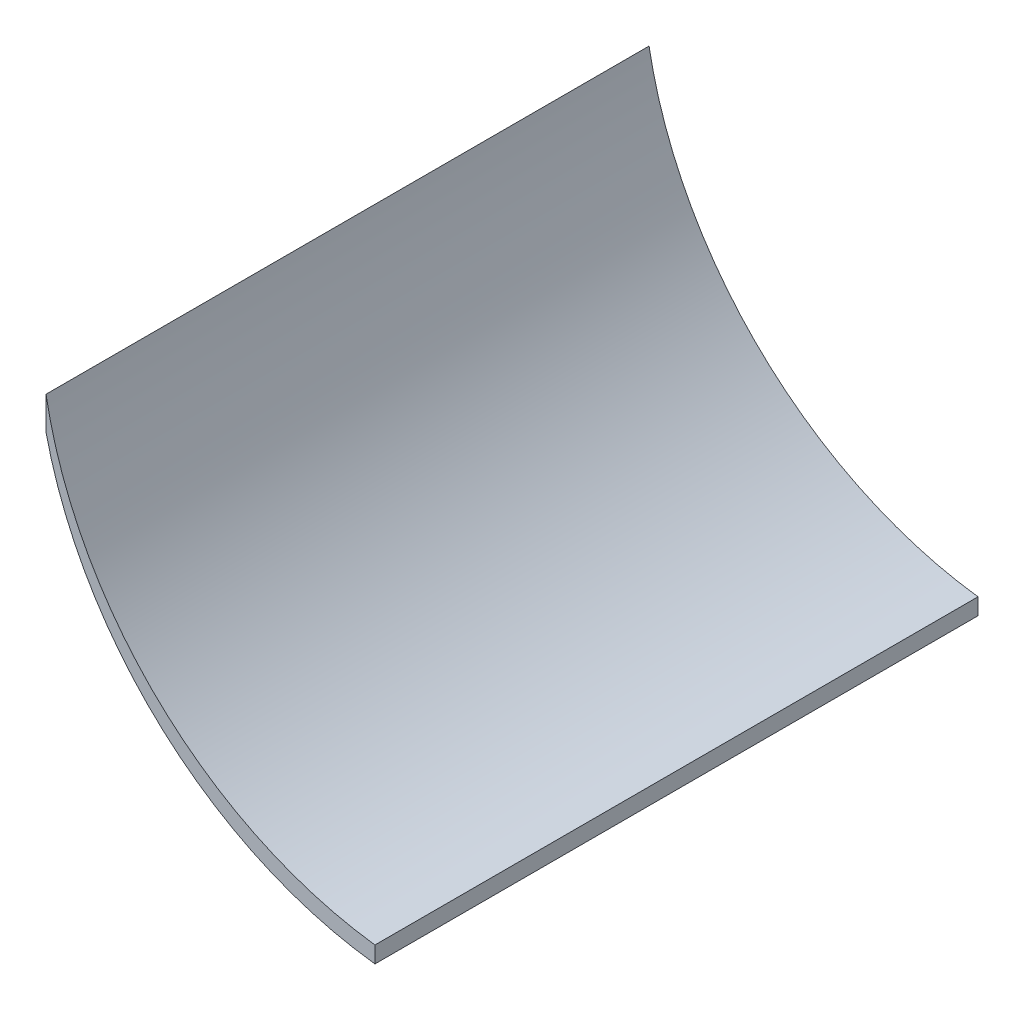
ISO-10303-21;
HEADER;
FILE_DESCRIPTION(('STEP AP214'),'2;1');
FILE_NAME('part.step','',(''),(''),'','','');
FILE_SCHEMA(('AUTOMOTIVE_DESIGN { 1 0 10303 214 1 1 1 1 }'));
ENDSEC;
DATA;
#1=APPLICATION_CONTEXT('core data for automotive mechanical design processes');
#2=APPLICATION_PROTOCOL_DEFINITION('international standard','automotive_design',2000,#1);
#3=PRODUCT_CONTEXT('',#1,'mechanical');
#4=PRODUCT('Part','Part','',(#3));
#5=PRODUCT_RELATED_PRODUCT_CATEGORY('part','',(#4));
#6=PRODUCT_DEFINITION_FORMATION('','',#4);
#7=PRODUCT_DEFINITION_CONTEXT('part definition',#1,'design');
#8=PRODUCT_DEFINITION('design','',#6,#7);
#9=PRODUCT_DEFINITION_SHAPE('','',#8);
#10=(LENGTH_UNIT() NAMED_UNIT(*) SI_UNIT(.MILLI.,.METRE.));
#11=(NAMED_UNIT(*) PLANE_ANGLE_UNIT() SI_UNIT($,.RADIAN.));
#12=(NAMED_UNIT(*) SI_UNIT($,.STERADIAN.) SOLID_ANGLE_UNIT());
#13=UNCERTAINTY_MEASURE_WITH_UNIT(LENGTH_MEASURE(1.E-05),#10,'distance_accuracy_value','');
#14=(GEOMETRIC_REPRESENTATION_CONTEXT(3) GLOBAL_UNCERTAINTY_ASSIGNED_CONTEXT((#13)) GLOBAL_UNIT_ASSIGNED_CONTEXT((#10,
#11,#12)) REPRESENTATION_CONTEXT('',''));
#15=CARTESIAN_POINT('',(0.,0.,0.));
#16=DIRECTION('',(0.,0.,1.));
#17=DIRECTION('',(1.,0.,0.));
#18=AXIS2_PLACEMENT_3D('',#15,#16,#17);
#19=CARTESIAN_POINT('',(86.6900353504617,19.6989281671796,139.7));
#20=DIRECTION('',(0.,0.,-1.));
#21=DIRECTION('',(-1.,0.,0.));
#22=AXIS2_PLACEMENT_3D('',#19,#20,#21);
#23=CYLINDRICAL_SURFACE('',#22,88.9);
#24=CARTESIAN_POINT('',(86.6900353504617,19.6989281671796,0.));
#25=DIRECTION('',(0.,0.,1.));
#26=DIRECTION('',(1.,0.,0.));
#27=AXIS2_PLACEMENT_3D('',#24,#25,#26);
#28=CIRCLE('',#27,88.9);
#29=CARTESIAN_POINT('',(0.,0.,0.));
#30=VERTEX_POINT('',#29);
#31=CARTESIAN_POINT('',(76.2,-68.58,0.));
#32=VERTEX_POINT('',#31);
#33=EDGE_CURVE('E95',#30,#32,#28,.T.);
#34=ORIENTED_EDGE('',*,*,#33,.T.);
#35=DIRECTION('',(0.,0.,-1.));
#36=VECTOR('',#35,1.);
#37=CARTESIAN_POINT('',(76.2,-68.58,139.7));
#38=LINE('',#37,#36);
#39=CARTESIAN_POINT('',(76.2,-68.58,139.7));
#40=VERTEX_POINT('',#39);
#41=EDGE_CURVE('E11',#40,#32,#38,.T.);
#42=ORIENTED_EDGE('',*,*,#41,.F.);
#43=CARTESIAN_POINT('',(86.6900353504617,19.6989281671796,139.7));
#44=DIRECTION('',(0.,0.,1.));
#45=DIRECTION('',(1.,0.,0.));
#46=AXIS2_PLACEMENT_3D('',#43,#44,#45);
#47=CIRCLE('',#46,88.9);
#48=CARTESIAN_POINT('',(0.,0.,139.7));
#49=VERTEX_POINT('',#48);
#50=EDGE_CURVE('E83',#49,#40,#47,.T.);
#51=ORIENTED_EDGE('',*,*,#50,.F.);
#52=DIRECTION('',(0.,0.,-1.));
#53=VECTOR('',#52,1.);
#54=CARTESIAN_POINT('',(0.,0.,139.7));
#55=LINE('',#54,#53);
#56=EDGE_CURVE('E91',#49,#30,#55,.T.);
#57=ORIENTED_EDGE('',*,*,#56,.T.);
#58=EDGE_LOOP('',(#34,#42,#51,#57));
#59=FACE_BOUND('',#58,.T.);
#60=ADVANCED_FACE('F32',(#59),#23,.T.);
#61=CARTESIAN_POINT('',(76.2,-68.58,139.7));
#62=DIRECTION('',(-1.,0.,0.));
#63=DIRECTION('',(0.,0.,1.));
#64=AXIS2_PLACEMENT_3D('',#61,#62,#63);
#65=PLANE('',#64);
#66=DIRECTION('',(0.,1.,0.));
#67=VECTOR('',#66,1.);
#68=CARTESIAN_POINT('',(76.2,-68.58,0.));
#69=LINE('',#68,#67);
#70=CARTESIAN_POINT('',(76.1999999999999,-64.77,0.));
#71=VERTEX_POINT('',#70);
#72=EDGE_CURVE('E87',#32,#71,#69,.T.);
#73=ORIENTED_EDGE('',*,*,#72,.T.);
#74=DIRECTION('',(0.,0.,-1.));
#75=VECTOR('',#74,1.);
#76=CARTESIAN_POINT('',(76.1999999999999,-64.77,139.7));
#77=LINE('',#76,#75);
#78=CARTESIAN_POINT('',(76.1999999999999,-64.77,139.7));
#79=VERTEX_POINT('',#78);
#80=EDGE_CURVE('E40',#79,#71,#77,.T.);
#81=ORIENTED_EDGE('',*,*,#80,.F.);
#82=DIRECTION('',(0.,1.,0.));
#83=VECTOR('',#82,1.);
#84=CARTESIAN_POINT('',(76.2,-68.58,139.7));
#85=LINE('',#84,#83);
#86=EDGE_CURVE('E78',#40,#79,#85,.T.);
#87=ORIENTED_EDGE('',*,*,#86,.F.);
#88=ORIENTED_EDGE('',*,*,#41,.T.);
#89=EDGE_LOOP('',(#73,#81,#87,#88));
#90=FACE_BOUND('',#89,.T.);
#91=ADVANCED_FACE('F86',(#90),#65,.F.);
#92=CARTESIAN_POINT('',(87.486371698676,23.410654419659,139.7));
#93=DIRECTION('',(0.,0.,-1.));
#94=DIRECTION('',(-1.,0.,0.));
#95=AXIS2_PLACEMENT_3D('',#92,#93,#94);
#96=CYLINDRICAL_SURFACE('',#95,88.9);
#97=CARTESIAN_POINT('',(87.486371698676,23.410654419659,0.));
#98=DIRECTION('',(0.,0.,-1.));
#99=DIRECTION('',(1.,0.,0.));
#100=AXIS2_PLACEMENT_3D('',#97,#98,#99);
#101=CIRCLE('',#100,88.9);
#102=CARTESIAN_POINT('',(0.,7.62,0.));
#103=VERTEX_POINT('',#102);
#104=EDGE_CURVE('E65',#71,#103,#101,.T.);
#105=ORIENTED_EDGE('',*,*,#104,.T.);
#106=DIRECTION('',(0.,0.,-1.));
#107=VECTOR('',#106,1.);
#108=CARTESIAN_POINT('',(0.,7.62,139.7));
#109=LINE('',#108,#107);
#110=CARTESIAN_POINT('',(0.,7.62,139.7));
#111=VERTEX_POINT('',#110);
#112=EDGE_CURVE('E88',#111,#103,#109,.T.);
#113=ORIENTED_EDGE('',*,*,#112,.F.);
#114=CARTESIAN_POINT('',(87.486371698676,23.410654419659,139.7));
#115=DIRECTION('',(0.,0.,-1.));
#116=DIRECTION('',(1.,0.,0.));
#117=AXIS2_PLACEMENT_3D('',#114,#115,#116);
#118=CIRCLE('',#117,88.9);
#119=EDGE_CURVE('E81',#79,#111,#118,.T.);
#120=ORIENTED_EDGE('',*,*,#119,.F.);
#121=ORIENTED_EDGE('',*,*,#80,.T.);
#122=EDGE_LOOP('',(#105,#113,#120,#121));
#123=FACE_BOUND('',#122,.T.);
#124=ADVANCED_FACE('F89',(#123),#96,.F.);
#125=CARTESIAN_POINT('',(0.,0.,139.7));
#126=DIRECTION('',(1.,0.,0.));
#127=DIRECTION('',(0.,0.,-1.));
#128=AXIS2_PLACEMENT_3D('',#125,#126,#127);
#129=PLANE('',#128);
#130=DIRECTION('',(0.,-1.,0.));
#131=VECTOR('',#130,1.);
#132=CARTESIAN_POINT('',(0.,0.,0.));
#133=LINE('',#132,#131);
#134=EDGE_CURVE('E71',#103,#30,#133,.T.);
#135=ORIENTED_EDGE('',*,*,#134,.T.);
#136=ORIENTED_EDGE('',*,*,#56,.F.);
#137=DIRECTION('',(0.,-1.,0.));
#138=VECTOR('',#137,1.);
#139=CARTESIAN_POINT('',(0.,0.,139.7));
#140=LINE('',#139,#138);
#141=EDGE_CURVE('E48',#111,#49,#140,.T.);
#142=ORIENTED_EDGE('',*,*,#141,.F.);
#143=ORIENTED_EDGE('',*,*,#112,.T.);
#144=EDGE_LOOP('',(#135,#136,#142,#143));
#145=FACE_BOUND('',#144,.T.);
#146=ADVANCED_FACE('F102',(#145),#129,.F.);
#147=CARTESIAN_POINT('',(86.6900353504617,19.6989281671796,139.7));
#148=DIRECTION('',(0.,0.,1.));
#149=DIRECTION('',(1.,0.,0.));
#150=AXIS2_PLACEMENT_3D('',#147,#148,#149);
#151=PLANE('',#150);
#152=ORIENTED_EDGE('',*,*,#50,.T.);
#153=ORIENTED_EDGE('',*,*,#86,.T.);
#154=ORIENTED_EDGE('',*,*,#119,.T.);
#155=ORIENTED_EDGE('',*,*,#141,.T.);
#156=EDGE_LOOP('',(#152,#153,#154,#155));
#157=FACE_BOUND('',#156,.T.);
#158=ADVANCED_FACE('F79',(#157),#151,.T.);
#159=CARTESIAN_POINT('',(86.6900353504617,19.6989281671796,0.));
#160=DIRECTION('',(0.,0.,1.));
#161=DIRECTION('',(1.,0.,0.));
#162=AXIS2_PLACEMENT_3D('',#159,#160,#161);
#163=PLANE('',#162);
#164=ORIENTED_EDGE('',*,*,#33,.F.);
#165=ORIENTED_EDGE('',*,*,#134,.F.);
#166=ORIENTED_EDGE('',*,*,#104,.F.);
#167=ORIENTED_EDGE('',*,*,#72,.F.);
#168=EDGE_LOOP('',(#164,#165,#166,#167));
#169=FACE_BOUND('',#168,.T.);
#170=ADVANCED_FACE('F105',(#169),#163,.F.);
#171=CLOSED_SHELL('',(#60,#91,#124,#146,#158,#170));
#172=MANIFOLD_SOLID_BREP('B2',#171);
#173=ADVANCED_BREP_SHAPE_REPRESENTATION('',(#18,#172),#14);
#174=SHAPE_DEFINITION_REPRESENTATION(#9,#173);
ENDSEC;
END-ISO-10303-21;
